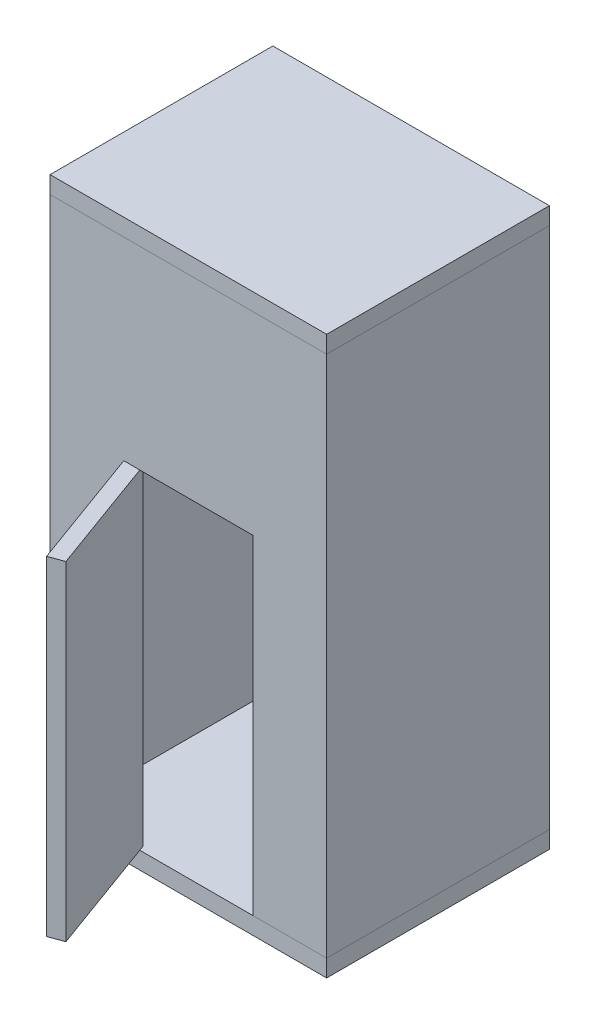
ISO-10303-21;
HEADER;
FILE_DESCRIPTION(('STEP AP214'),'2;1');
FILE_NAME('part.step','',(''),(''),'','','');
FILE_SCHEMA(('AUTOMOTIVE_DESIGN { 1 0 10303 214 1 1 1 1 }'));
ENDSEC;
DATA;
#1=APPLICATION_CONTEXT('core data for automotive mechanical design processes');
#2=APPLICATION_PROTOCOL_DEFINITION('international standard','automotive_design',2000,#1);
#3=PRODUCT_CONTEXT('',#1,'mechanical');
#4=PRODUCT('Part','Part','',(#3));
#5=PRODUCT_RELATED_PRODUCT_CATEGORY('part','',(#4));
#6=PRODUCT_DEFINITION_FORMATION('','',#4);
#7=PRODUCT_DEFINITION_CONTEXT('part definition',#1,'design');
#8=PRODUCT_DEFINITION('design','',#6,#7);
#9=PRODUCT_DEFINITION_SHAPE('','',#8);
#10=(LENGTH_UNIT() NAMED_UNIT(*) SI_UNIT(.MILLI.,.METRE.));
#11=(NAMED_UNIT(*) PLANE_ANGLE_UNIT() SI_UNIT($,.RADIAN.));
#12=(NAMED_UNIT(*) SI_UNIT($,.STERADIAN.) SOLID_ANGLE_UNIT());
#13=UNCERTAINTY_MEASURE_WITH_UNIT(LENGTH_MEASURE(1.E-05),#10,'distance_accuracy_value','');
#14=(GEOMETRIC_REPRESENTATION_CONTEXT(3) GLOBAL_UNCERTAINTY_ASSIGNED_CONTEXT((#13)) GLOBAL_UNIT_ASSIGNED_CONTEXT((#10,
#11,#12)) REPRESENTATION_CONTEXT('',''));
#15=CARTESIAN_POINT('',(0.,0.,0.));
#16=DIRECTION('',(0.,0.,1.));
#17=DIRECTION('',(1.,0.,0.));
#18=AXIS2_PLACEMENT_3D('',#15,#16,#17);
#19=CARTESIAN_POINT('',(0.,1943.1,0.));
#20=DIRECTION('',(0.,1.,0.));
#21=DIRECTION('',(0.,0.,1.));
#22=AXIS2_PLACEMENT_3D('',#19,#20,#21);
#23=PLANE('',#22);
#24=DIRECTION('',(0.939692620785909,0.,-0.342020143325667));
#25=VECTOR('',#24,1.);
#26=CARTESIAN_POINT('',(-297.461326012133,1943.1,626.819409258348));
#27=LINE('',#26,#25);
#28=CARTESIAN_POINT('',(-381.,1943.1,657.225));
#29=VERTEX_POINT('',#28);
#30=CARTESIAN_POINT('',(-297.461326012133,1943.1,626.819409258348));
#31=VERTEX_POINT('',#30);
#32=EDGE_CURVE('E101',#29,#31,#27,.T.);
#33=ORIENTED_EDGE('',*,*,#32,.F.);
#34=DIRECTION('',(-0.342020143325665,0.,-0.93969262078591));
#35=VECTOR('',#34,1.);
#36=CARTESIAN_POINT('',(-381.,1943.1,657.225));
#37=LINE('',#36,#35);
#38=CARTESIAN_POINT('',(-120.380650785843,1943.10000000001,1373.27077703886));
#39=VERTEX_POINT('',#38);
#40=EDGE_CURVE('E112',#39,#29,#37,.T.);
#41=ORIENTED_EDGE('',*,*,#40,.F.);
#42=DIRECTION('',(-0.939692620785909,0.,0.342020143325667));
#43=VECTOR('',#42,1.);
#44=CARTESIAN_POINT('',(-120.380650785843,1943.10000000001,1373.27077703886));
#45=LINE('',#44,#43);
#46=CARTESIAN_POINT('',(-36.8419767979757,1943.10000000001,1342.86518629721));
#47=VERTEX_POINT('',#46);
#48=EDGE_CURVE('E103',#47,#39,#45,.T.);
#49=ORIENTED_EDGE('',*,*,#48,.F.);
#50=DIRECTION('',(0.342020143325665,0.,0.93969262078591));
#51=VECTOR('',#50,1.);
#52=CARTESIAN_POINT('',(-36.8419767979757,1943.10000000001,1342.86518629721));
#53=LINE('',#52,#51);
#54=EDGE_CURVE('E93',#31,#47,#53,.T.);
#55=ORIENTED_EDGE('',*,*,#54,.F.);
#56=EDGE_LOOP('',(#33,#41,#49,#55));
#57=FACE_BOUND('',#56,.T.);
#58=ADVANCED_FACE('F51',(#57),#23,.T.);
#59=CARTESIAN_POINT('',(-381.,-821.969822679475,657.224999999999));
#60=DIRECTION('',(0.93969262078591,0.,-0.342020143325665));
#61=DIRECTION('',(-0.342020143325665,0.,-0.93969262078591));
#62=AXIS2_PLACEMENT_3D('',#59,#60,#61);
#63=PLANE('',#62);
#64=DIRECTION('',(0.,1.,0.));
#65=VECTOR('',#64,1.);
#66=CARTESIAN_POINT('',(-381.,-821.969822679475,657.224999999999));
#67=LINE('',#66,#65);
#68=CARTESIAN_POINT('',(-381.,0.,657.225));
#69=VERTEX_POINT('',#68);
#70=EDGE_CURVE('E106',#69,#29,#67,.T.);
#71=ORIENTED_EDGE('',*,*,#70,.F.);
#72=DIRECTION('',(0.342020143325665,0.,0.93969262078591));
#73=VECTOR('',#72,1.);
#74=CARTESIAN_POINT('',(-381.,0.,657.225));
#75=LINE('',#74,#73);
#76=CARTESIAN_POINT('',(-120.380650785843,-2.22044604925031E-13,1373.27077703886));
#77=VERTEX_POINT('',#76);
#78=EDGE_CURVE('E55',#69,#77,#75,.T.);
#79=ORIENTED_EDGE('',*,*,#78,.T.);
#80=DIRECTION('',(0.,1.,0.));
#81=VECTOR('',#80,1.);
#82=CARTESIAN_POINT('',(-120.380650785843,-821.969822679476,1373.27077703886));
#83=LINE('',#82,#81);
#84=EDGE_CURVE('E115',#77,#39,#83,.T.);
#85=ORIENTED_EDGE('',*,*,#84,.T.);
#86=ORIENTED_EDGE('',*,*,#40,.T.);
#87=EDGE_LOOP('',(#71,#79,#85,#86));
#88=FACE_BOUND('',#87,.T.);
#89=ADVANCED_FACE('F124',(#88),#63,.F.);
#90=CARTESIAN_POINT('',(-120.380650785843,-821.969822679476,1373.27077703886));
#91=DIRECTION('',(-0.342020143325667,0.,-0.939692620785909));
#92=DIRECTION('',(-0.939692620785909,0.,0.342020143325667));
#93=AXIS2_PLACEMENT_3D('',#90,#91,#92);
#94=PLANE('',#93);
#95=ORIENTED_EDGE('',*,*,#84,.F.);
#96=DIRECTION('',(0.939692620785909,0.,-0.342020143325667));
#97=VECTOR('',#96,1.);
#98=CARTESIAN_POINT('',(-120.380650785843,0.,1373.27077703886));
#99=LINE('',#98,#97);
#100=CARTESIAN_POINT('',(-36.8419767979755,0.,1342.86518629721));
#101=VERTEX_POINT('',#100);
#102=EDGE_CURVE('E121',#77,#101,#99,.T.);
#103=ORIENTED_EDGE('',*,*,#102,.T.);
#104=DIRECTION('',(0.,1.,0.));
#105=VECTOR('',#104,1.);
#106=CARTESIAN_POINT('',(-36.8419767979757,-821.969822679475,1342.86518629721));
#107=LINE('',#106,#105);
#108=EDGE_CURVE('E97',#101,#47,#107,.T.);
#109=ORIENTED_EDGE('',*,*,#108,.T.);
#110=ORIENTED_EDGE('',*,*,#48,.T.);
#111=EDGE_LOOP('',(#95,#103,#109,#110));
#112=FACE_BOUND('',#111,.T.);
#113=ADVANCED_FACE('F120',(#112),#94,.F.);
#114=CARTESIAN_POINT('',(-36.8419767979757,-821.969822679475,1342.86518629721));
#115=DIRECTION('',(-0.93969262078591,0.,0.342020143325665));
#116=DIRECTION('',(0.342020143325665,0.,0.93969262078591));
#117=AXIS2_PLACEMENT_3D('',#114,#115,#116);
#118=PLANE('',#117);
#119=ORIENTED_EDGE('',*,*,#108,.F.);
#120=DIRECTION('',(-0.342020143325665,0.,-0.93969262078591));
#121=VECTOR('',#120,1.);
#122=CARTESIAN_POINT('',(-36.8419767979755,0.,1342.86518629721));
#123=LINE('',#122,#121);
#124=CARTESIAN_POINT('',(-297.461326012133,0.,626.819409258348));
#125=VERTEX_POINT('',#124);
#126=EDGE_CURVE('E60',#101,#125,#123,.T.);
#127=ORIENTED_EDGE('',*,*,#126,.T.);
#128=DIRECTION('',(0.,1.,0.));
#129=VECTOR('',#128,1.);
#130=CARTESIAN_POINT('',(-297.461326012133,-821.969822679475,626.819409258347));
#131=LINE('',#130,#129);
#132=EDGE_CURVE('E90',#125,#31,#131,.T.);
#133=ORIENTED_EDGE('',*,*,#132,.T.);
#134=ORIENTED_EDGE('',*,*,#54,.T.);
#135=EDGE_LOOP('',(#119,#127,#133,#134));
#136=FACE_BOUND('',#135,.T.);
#137=ADVANCED_FACE('F92',(#136),#118,.F.);
#138=CARTESIAN_POINT('',(-297.461326012133,-821.969822679475,626.819409258347));
#139=DIRECTION('',(0.342020143325667,0.,0.939692620785909));
#140=DIRECTION('',(0.939692620785909,0.,-0.342020143325667));
#141=AXIS2_PLACEMENT_3D('',#138,#139,#140);
#142=PLANE('',#141);
#143=ORIENTED_EDGE('',*,*,#132,.F.);
#144=DIRECTION('',(-0.939692620785909,0.,0.342020143325667));
#145=VECTOR('',#144,1.);
#146=CARTESIAN_POINT('',(-297.461326012133,0.,626.819409258348));
#147=LINE('',#146,#145);
#148=EDGE_CURVE('E12',#125,#69,#147,.T.);
#149=ORIENTED_EDGE('',*,*,#148,.T.);
#150=ORIENTED_EDGE('',*,*,#70,.T.);
#151=ORIENTED_EDGE('',*,*,#32,.T.);
#152=EDGE_LOOP('',(#143,#149,#150,#151));
#153=FACE_BOUND('',#152,.T.);
#154=ADVANCED_FACE('F53',(#153),#142,.F.);
#155=CARTESIAN_POINT('',(0.,0.,0.));
#156=DIRECTION('',(0.,1.,0.));
#157=DIRECTION('',(0.,0.,1.));
#158=AXIS2_PLACEMENT_3D('',#155,#156,#157);
#159=PLANE('',#158);
#160=ORIENTED_EDGE('',*,*,#126,.F.);
#161=ORIENTED_EDGE('',*,*,#102,.F.);
#162=ORIENTED_EDGE('',*,*,#78,.F.);
#163=ORIENTED_EDGE('',*,*,#148,.F.);
#164=EDGE_LOOP('',(#160,#161,#162,#163));
#165=FACE_BOUND('',#164,.T.);
#166=ADVANCED_FACE('F138',(#165),#159,.F.);
#167=CLOSED_SHELL('',(#58,#89,#113,#137,#154,#166));
#168=MANIFOLD_SOLID_BREP('B2',#167);
#169=CARTESIAN_POINT('',(815.975000000001,-101.6,-657.225));
#170=DIRECTION('',(-1.,0.,0.));
#171=DIRECTION('',(0.,0.,1.));
#172=AXIS2_PLACEMENT_3D('',#169,#170,#171);
#173=PLANE('',#172);
#174=DIRECTION('',(0.,0.,1.));
#175=VECTOR('',#174,1.);
#176=CARTESIAN_POINT('',(815.975000000001,0.,-657.225));
#177=LINE('',#176,#175);
#178=CARTESIAN_POINT('',(815.975000000001,0.,-657.225));
#179=VERTEX_POINT('',#178);
#180=CARTESIAN_POINT('',(815.974999999999,6.10622663543836E-13,657.224999999999));
#181=VERTEX_POINT('',#180);
#182=EDGE_CURVE('E247',#179,#181,#177,.T.);
#183=ORIENTED_EDGE('',*,*,#182,.T.);
#184=DIRECTION('',(0.,1.,0.));
#185=VECTOR('',#184,1.);
#186=CARTESIAN_POINT('',(815.974999999999,-101.6,657.225));
#187=LINE('',#186,#185);
#188=CARTESIAN_POINT('',(815.974999999999,-101.6,657.225));
#189=VERTEX_POINT('',#188);
#190=EDGE_CURVE('E49',#189,#181,#187,.T.);
#191=ORIENTED_EDGE('',*,*,#190,.F.);
#192=DIRECTION('',(0.,0.,1.));
#193=VECTOR('',#192,1.);
#194=CARTESIAN_POINT('',(815.975000000001,-101.6,-657.225));
#195=LINE('',#194,#193);
#196=CARTESIAN_POINT('',(815.975000000001,-101.6,-657.225));
#197=VERTEX_POINT('',#196);
#198=EDGE_CURVE('E235',#197,#189,#195,.T.);
#199=ORIENTED_EDGE('',*,*,#198,.F.);
#200=DIRECTION('',(0.,1.,0.));
#201=VECTOR('',#200,1.);
#202=CARTESIAN_POINT('',(815.975000000001,-101.6,-657.225));
#203=LINE('',#202,#201);
#204=EDGE_CURVE('E243',#197,#179,#203,.T.);
#205=ORIENTED_EDGE('',*,*,#204,.T.);
#206=EDGE_LOOP('',(#183,#191,#199,#205));
#207=FACE_BOUND('',#206,.T.);
#208=ADVANCED_FACE('F184',(#207),#173,.F.);
#209=CARTESIAN_POINT('',(-815.975,-101.6,657.225));
#210=DIRECTION('',(0.,0.,-1.));
#211=DIRECTION('',(-1.,0.,0.));
#212=AXIS2_PLACEMENT_3D('',#209,#210,#211);
#213=PLANE('',#212);
#214=DIRECTION('',(-1.,0.,0.));
#215=VECTOR('',#214,1.);
#216=CARTESIAN_POINT('',(-815.975,6.10622663543836E-13,657.225));
#217=LINE('',#216,#215);
#218=CARTESIAN_POINT('',(-815.975,6.10622663543836E-13,657.225));
#219=VERTEX_POINT('',#218);
#220=EDGE_CURVE('E239',#181,#219,#217,.T.);
#221=ORIENTED_EDGE('',*,*,#220,.T.);
#222=DIRECTION('',(0.,1.,0.));
#223=VECTOR('',#222,1.);
#224=CARTESIAN_POINT('',(-815.975,-101.6,657.225));
#225=LINE('',#224,#223);
#226=CARTESIAN_POINT('',(-815.975,-101.6,657.225));
#227=VERTEX_POINT('',#226);
#228=EDGE_CURVE('E192',#227,#219,#225,.T.);
#229=ORIENTED_EDGE('',*,*,#228,.F.);
#230=DIRECTION('',(-1.,0.,0.));
#231=VECTOR('',#230,1.);
#232=CARTESIAN_POINT('',(-815.975,-101.6,657.225));
#233=LINE('',#232,#231);
#234=EDGE_CURVE('E230',#189,#227,#233,.T.);
#235=ORIENTED_EDGE('',*,*,#234,.F.);
#236=ORIENTED_EDGE('',*,*,#190,.T.);
#237=EDGE_LOOP('',(#221,#229,#235,#236));
#238=FACE_BOUND('',#237,.T.);
#239=ADVANCED_FACE('F238',(#238),#213,.F.);
#240=CARTESIAN_POINT('',(-815.974999999998,-101.6,-657.225));
#241=DIRECTION('',(1.,0.,0.));
#242=DIRECTION('',(0.,0.,-1.));
#243=AXIS2_PLACEMENT_3D('',#240,#241,#242);
#244=PLANE('',#243);
#245=DIRECTION('',(0.,0.,-1.));
#246=VECTOR('',#245,1.);
#247=CARTESIAN_POINT('',(-815.975,0.,-657.225));
#248=LINE('',#247,#246);
#249=CARTESIAN_POINT('',(-815.975,0.,-657.225));
#250=VERTEX_POINT('',#249);
#251=EDGE_CURVE('E217',#219,#250,#248,.T.);
#252=ORIENTED_EDGE('',*,*,#251,.T.);
#253=DIRECTION('',(0.,1.,0.));
#254=VECTOR('',#253,1.);
#255=CARTESIAN_POINT('',(-815.974999999998,-101.6,-657.225));
#256=LINE('',#255,#254);
#257=CARTESIAN_POINT('',(-815.974999999998,-101.6,-657.225));
#258=VERTEX_POINT('',#257);
#259=EDGE_CURVE('E240',#258,#250,#256,.T.);
#260=ORIENTED_EDGE('',*,*,#259,.F.);
#261=DIRECTION('',(0.,0.,-1.));
#262=VECTOR('',#261,1.);
#263=CARTESIAN_POINT('',(-815.974999999998,-101.6,-657.225));
#264=LINE('',#263,#262);
#265=EDGE_CURVE('E233',#227,#258,#264,.T.);
#266=ORIENTED_EDGE('',*,*,#265,.F.);
#267=ORIENTED_EDGE('',*,*,#228,.T.);
#268=EDGE_LOOP('',(#252,#260,#266,#267));
#269=FACE_BOUND('',#268,.T.);
#270=ADVANCED_FACE('F241',(#269),#244,.F.);
#271=CARTESIAN_POINT('',(-815.974999999998,-101.6,-657.225));
#272=DIRECTION('',(0.,0.,1.));
#273=DIRECTION('',(1.,0.,0.));
#274=AXIS2_PLACEMENT_3D('',#271,#272,#273);
#275=PLANE('',#274);
#276=DIRECTION('',(1.,0.,0.));
#277=VECTOR('',#276,1.);
#278=CARTESIAN_POINT('',(-815.975,0.,-657.225));
#279=LINE('',#278,#277);
#280=EDGE_CURVE('E223',#250,#179,#279,.T.);
#281=ORIENTED_EDGE('',*,*,#280,.T.);
#282=ORIENTED_EDGE('',*,*,#204,.F.);
#283=DIRECTION('',(1.,0.,0.));
#284=VECTOR('',#283,1.);
#285=CARTESIAN_POINT('',(-815.974999999998,-101.6,-657.225));
#286=LINE('',#285,#284);
#287=EDGE_CURVE('E200',#258,#197,#286,.T.);
#288=ORIENTED_EDGE('',*,*,#287,.F.);
#289=ORIENTED_EDGE('',*,*,#259,.T.);
#290=EDGE_LOOP('',(#281,#282,#288,#289));
#291=FACE_BOUND('',#290,.T.);
#292=ADVANCED_FACE('F254',(#291),#275,.F.);
#293=CARTESIAN_POINT('',(0.,-101.6,0.));
#294=DIRECTION('',(0.,1.,0.));
#295=DIRECTION('',(0.,0.,1.));
#296=AXIS2_PLACEMENT_3D('',#293,#294,#295);
#297=PLANE('',#296);
#298=ORIENTED_EDGE('',*,*,#198,.T.);
#299=ORIENTED_EDGE('',*,*,#234,.T.);
#300=ORIENTED_EDGE('',*,*,#265,.T.);
#301=ORIENTED_EDGE('',*,*,#287,.T.);
#302=EDGE_LOOP('',(#298,#299,#300,#301));
#303=FACE_BOUND('',#302,.T.);
#304=ADVANCED_FACE('F231',(#303),#297,.F.);
#305=CARTESIAN_POINT('',(0.,0.,0.));
#306=DIRECTION('',(0.,1.,0.));
#307=DIRECTION('',(0.,0.,1.));
#308=AXIS2_PLACEMENT_3D('',#305,#306,#307);
#309=PLANE('',#308);
#310=ORIENTED_EDGE('',*,*,#182,.F.);
#311=ORIENTED_EDGE('',*,*,#280,.F.);
#312=ORIENTED_EDGE('',*,*,#251,.F.);
#313=ORIENTED_EDGE('',*,*,#220,.F.);
#314=EDGE_LOOP('',(#310,#311,#312,#313));
#315=FACE_BOUND('',#314,.T.);
#316=ADVANCED_FACE('F257',(#315),#309,.T.);
#317=CLOSED_SHELL('',(#208,#239,#270,#292,#304,#316));
#318=MANIFOLD_SOLID_BREP('B6',#317);
#319=CARTESIAN_POINT('',(-815.975000000002,3187.7,657.224999999999));
#320=DIRECTION('',(0.,0.,-1.));
#321=DIRECTION('',(-1.,0.,0.));
#322=AXIS2_PLACEMENT_3D('',#319,#320,#321);
#323=PLANE('',#322);
#324=DIRECTION('',(1.,0.,0.));
#325=VECTOR('',#324,1.);
#326=CARTESIAN_POINT('',(-815.975,3086.1,657.224999999999));
#327=LINE('',#326,#325);
#328=CARTESIAN_POINT('',(-815.975,3086.1,657.224999999999));
#329=VERTEX_POINT('',#328);
#330=CARTESIAN_POINT('',(815.974999999999,3086.1,657.225));
#331=VERTEX_POINT('',#330);
#332=EDGE_CURVE('E379',#329,#331,#327,.T.);
#333=ORIENTED_EDGE('',*,*,#332,.T.);
#334=DIRECTION('',(0.,-1.,0.));
#335=VECTOR('',#334,1.);
#336=CARTESIAN_POINT('',(815.974999999999,3187.7,657.225));
#337=LINE('',#336,#335);
#338=CARTESIAN_POINT('',(815.974999999999,3187.7,657.225));
#339=VERTEX_POINT('',#338);
#340=EDGE_CURVE('E182',#339,#331,#337,.T.);
#341=ORIENTED_EDGE('',*,*,#340,.F.);
#342=DIRECTION('',(1.,0.,0.));
#343=VECTOR('',#342,1.);
#344=CARTESIAN_POINT('',(-815.975000000002,3187.7,657.224999999999));
#345=LINE('',#344,#343);
#346=CARTESIAN_POINT('',(-815.975000000002,3187.7,657.224999999999));
#347=VERTEX_POINT('',#346);
#348=EDGE_CURVE('E367',#347,#339,#345,.T.);
#349=ORIENTED_EDGE('',*,*,#348,.F.);
#350=DIRECTION('',(0.,-1.,0.));
#351=VECTOR('',#350,1.);
#352=CARTESIAN_POINT('',(-815.975000000002,3187.7,657.224999999999));
#353=LINE('',#352,#351);
#354=EDGE_CURVE('E375',#347,#329,#353,.T.);
#355=ORIENTED_EDGE('',*,*,#354,.T.);
#356=EDGE_LOOP('',(#333,#341,#349,#355));
#357=FACE_BOUND('',#356,.T.);
#358=ADVANCED_FACE('F316',(#357),#323,.F.);
#359=CARTESIAN_POINT('',(815.974999999999,3187.7,657.225));
#360=DIRECTION('',(-1.,0.,0.));
#361=DIRECTION('',(0.,0.,1.));
#362=AXIS2_PLACEMENT_3D('',#359,#360,#361);
#363=PLANE('',#362);
#364=DIRECTION('',(0.,0.,-1.));
#365=VECTOR('',#364,1.);
#366=CARTESIAN_POINT('',(815.974999999999,3086.1,657.225));
#367=LINE('',#366,#365);
#368=CARTESIAN_POINT('',(815.975000000001,3086.1,-657.225));
#369=VERTEX_POINT('',#368);
#370=EDGE_CURVE('E371',#331,#369,#367,.T.);
#371=ORIENTED_EDGE('',*,*,#370,.T.);
#372=DIRECTION('',(0.,-1.,0.));
#373=VECTOR('',#372,1.);
#374=CARTESIAN_POINT('',(815.974999999999,3187.7,-657.225));
#375=LINE('',#374,#373);
#376=CARTESIAN_POINT('',(815.974999999999,3187.7,-657.225));
#377=VERTEX_POINT('',#376);
#378=EDGE_CURVE('E324',#377,#369,#375,.T.);
#379=ORIENTED_EDGE('',*,*,#378,.F.);
#380=DIRECTION('',(0.,0.,-1.));
#381=VECTOR('',#380,1.);
#382=CARTESIAN_POINT('',(815.974999999999,3187.7,657.225));
#383=LINE('',#382,#381);
#384=EDGE_CURVE('E362',#339,#377,#383,.T.);
#385=ORIENTED_EDGE('',*,*,#384,.F.);
#386=ORIENTED_EDGE('',*,*,#340,.T.);
#387=EDGE_LOOP('',(#371,#379,#385,#386));
#388=FACE_BOUND('',#387,.T.);
#389=ADVANCED_FACE('F370',(#388),#363,.F.);
#390=CARTESIAN_POINT('',(815.974999999999,3187.7,-657.225));
#391=DIRECTION('',(0.,0.,1.));
#392=DIRECTION('',(1.,0.,0.));
#393=AXIS2_PLACEMENT_3D('',#390,#391,#392);
#394=PLANE('',#393);
#395=DIRECTION('',(-1.,0.,0.));
#396=VECTOR('',#395,1.);
#397=CARTESIAN_POINT('',(815.975000000001,3086.1,-657.225));
#398=LINE('',#397,#396);
#399=CARTESIAN_POINT('',(-815.975,3086.1,-657.225));
#400=VERTEX_POINT('',#399);
#401=EDGE_CURVE('E349',#369,#400,#398,.T.);
#402=ORIENTED_EDGE('',*,*,#401,.T.);
#403=DIRECTION('',(0.,-1.,0.));
#404=VECTOR('',#403,1.);
#405=CARTESIAN_POINT('',(-815.975,3187.7,-657.225));
#406=LINE('',#405,#404);
#407=CARTESIAN_POINT('',(-815.975,3187.7,-657.225));
#408=VERTEX_POINT('',#407);
#409=EDGE_CURVE('E372',#408,#400,#406,.T.);
#410=ORIENTED_EDGE('',*,*,#409,.F.);
#411=DIRECTION('',(-1.,0.,0.));
#412=VECTOR('',#411,1.);
#413=CARTESIAN_POINT('',(815.974999999999,3187.7,-657.225));
#414=LINE('',#413,#412);
#415=EDGE_CURVE('E365',#377,#408,#414,.T.);
#416=ORIENTED_EDGE('',*,*,#415,.F.);
#417=ORIENTED_EDGE('',*,*,#378,.T.);
#418=EDGE_LOOP('',(#402,#410,#416,#417));
#419=FACE_BOUND('',#418,.T.);
#420=ADVANCED_FACE('F373',(#419),#394,.F.);
#421=CARTESIAN_POINT('',(-815.975,3187.7,-657.225));
#422=DIRECTION('',(1.,0.,0.));
#423=DIRECTION('',(0.,0.,-1.));
#424=AXIS2_PLACEMENT_3D('',#421,#422,#423);
#425=PLANE('',#424);
#426=DIRECTION('',(0.,0.,1.));
#427=VECTOR('',#426,1.);
#428=CARTESIAN_POINT('',(-815.975,3086.1,-657.225));
#429=LINE('',#428,#427);
#430=EDGE_CURVE('E355',#400,#329,#429,.T.);
#431=ORIENTED_EDGE('',*,*,#430,.T.);
#432=ORIENTED_EDGE('',*,*,#354,.F.);
#433=DIRECTION('',(0.,0.,1.));
#434=VECTOR('',#433,1.);
#435=CARTESIAN_POINT('',(-815.975,3187.7,-657.225));
#436=LINE('',#435,#434);
#437=EDGE_CURVE('E332',#408,#347,#436,.T.);
#438=ORIENTED_EDGE('',*,*,#437,.F.);
#439=ORIENTED_EDGE('',*,*,#409,.T.);
#440=EDGE_LOOP('',(#431,#432,#438,#439));
#441=FACE_BOUND('',#440,.T.);
#442=ADVANCED_FACE('F386',(#441),#425,.F.);
#443=CARTESIAN_POINT('',(0.,3187.7,0.));
#444=DIRECTION('',(0.,1.,0.));
#445=DIRECTION('',(0.,0.,1.));
#446=AXIS2_PLACEMENT_3D('',#443,#444,#445);
#447=PLANE('',#446);
#448=ORIENTED_EDGE('',*,*,#348,.T.);
#449=ORIENTED_EDGE('',*,*,#384,.T.);
#450=ORIENTED_EDGE('',*,*,#415,.T.);
#451=ORIENTED_EDGE('',*,*,#437,.T.);
#452=EDGE_LOOP('',(#448,#449,#450,#451));
#453=FACE_BOUND('',#452,.T.);
#454=ADVANCED_FACE('F363',(#453),#447,.T.);
#455=CARTESIAN_POINT('',(0.,3086.1,0.));
#456=DIRECTION('',(0.,1.,0.));
#457=DIRECTION('',(0.,0.,1.));
#458=AXIS2_PLACEMENT_3D('',#455,#456,#457);
#459=PLANE('',#458);
#460=ORIENTED_EDGE('',*,*,#332,.F.);
#461=ORIENTED_EDGE('',*,*,#430,.F.);
#462=ORIENTED_EDGE('',*,*,#401,.F.);
#463=ORIENTED_EDGE('',*,*,#370,.F.);
#464=EDGE_LOOP('',(#460,#461,#462,#463));
#465=FACE_BOUND('',#464,.T.);
#466=ADVANCED_FACE('F389',(#465),#459,.F.);
#467=CLOSED_SHELL('',(#358,#389,#420,#442,#454,#466));
#468=MANIFOLD_SOLID_BREP('B43',#467);
#469=CARTESIAN_POINT('',(0.,0.,0.));
#470=DIRECTION('',(0.,-1.,0.));
#471=DIRECTION('',(0.,0.,-1.));
#472=AXIS2_PLACEMENT_3D('',#469,#470,#471);
#473=PLANE('',#472);
#474=DIRECTION('',(-1.,0.,0.));
#475=VECTOR('',#474,1.);
#476=CARTESIAN_POINT('',(-815.975,0.,-657.225));
#477=LINE('',#476,#475);
#478=CARTESIAN_POINT('',(-714.375,0.,-657.225));
#479=VERTEX_POINT('',#478);
#480=CARTESIAN_POINT('',(-815.975,0.,-657.225));
#481=VERTEX_POINT('',#480);
#482=EDGE_CURVE('E555',#479,#481,#477,.T.);
#483=ORIENTED_EDGE('',*,*,#482,.F.);
#484=DIRECTION('',(0.,0.,1.));
#485=VECTOR('',#484,1.);
#486=CARTESIAN_POINT('',(-714.375,0.,555.625));
#487=LINE('',#486,#485);
#488=CARTESIAN_POINT('',(-714.375,0.,555.625));
#489=VERTEX_POINT('',#488);
#490=EDGE_CURVE('E539',#479,#489,#487,.T.);
#491=ORIENTED_EDGE('',*,*,#490,.T.);
#492=DIRECTION('',(1.,0.,0.));
#493=VECTOR('',#492,1.);
#494=CARTESIAN_POINT('',(-714.375,0.,555.625));
#495=LINE('',#494,#493);
#496=CARTESIAN_POINT('',(-381.,0.,555.625));
#497=VERTEX_POINT('',#496);
#498=EDGE_CURVE('E597',#489,#497,#495,.T.);
#499=ORIENTED_EDGE('',*,*,#498,.T.);
#500=DIRECTION('',(0.,0.,1.));
#501=VECTOR('',#500,1.);
#502=CARTESIAN_POINT('',(-381.,0.,-657.226));
#503=LINE('',#502,#501);
#504=CARTESIAN_POINT('',(-381.,0.,657.225));
#505=VERTEX_POINT('',#504);
#506=EDGE_CURVE('E603',#497,#505,#503,.T.);
#507=ORIENTED_EDGE('',*,*,#506,.T.);
#508=DIRECTION('',(1.,0.,0.));
#509=VECTOR('',#508,1.);
#510=CARTESIAN_POINT('',(-815.975,6.10622663543836E-13,657.225));
#511=LINE('',#510,#509);
#512=CARTESIAN_POINT('',(-815.975,6.10622663543836E-13,657.225));
#513=VERTEX_POINT('',#512);
#514=EDGE_CURVE('E572',#513,#505,#511,.T.);
#515=ORIENTED_EDGE('',*,*,#514,.F.);
#516=DIRECTION('',(0.,0.,1.));
#517=VECTOR('',#516,1.);
#518=CARTESIAN_POINT('',(-815.975,6.10622663543836E-13,657.225));
#519=LINE('',#518,#517);
#520=EDGE_CURVE('E562',#481,#513,#519,.T.);
#521=ORIENTED_EDGE('',*,*,#520,.F.);
#522=EDGE_LOOP('',(#483,#491,#499,#507,#515,#521));
#523=FACE_BOUND('',#522,.T.);
#524=ADVANCED_FACE('F439',(#523),#473,.T.);
#525=CARTESIAN_POINT('',(-815.975,3086.1,-657.225));
#526=DIRECTION('',(0.,0.,1.));
#527=DIRECTION('',(1.,0.,0.));
#528=AXIS2_PLACEMENT_3D('',#525,#526,#527);
#529=PLANE('',#528);
#530=DIRECTION('',(-1.,0.,0.));
#531=VECTOR('',#530,1.);
#532=CARTESIAN_POINT('',(-815.975,3086.1,-657.225));
#533=LINE('',#532,#531);
#534=CARTESIAN_POINT('',(-714.375,3086.1,-657.225));
#535=VERTEX_POINT('',#534);
#536=CARTESIAN_POINT('',(-815.975,3086.1,-657.225));
#537=VERTEX_POINT('',#536);
#538=EDGE_CURVE('E557',#535,#537,#533,.T.);
#539=ORIENTED_EDGE('',*,*,#538,.F.);
#540=DIRECTION('',(0.,-1.,0.));
#541=VECTOR('',#540,1.);
#542=CARTESIAN_POINT('',(-714.375,3086.1,-657.225));
#543=LINE('',#542,#541);
#544=EDGE_CURVE('E542',#535,#479,#543,.T.);
#545=ORIENTED_EDGE('',*,*,#544,.T.);
#546=ORIENTED_EDGE('',*,*,#482,.T.);
#547=DIRECTION('',(0.,-1.,0.));
#548=VECTOR('',#547,1.);
#549=CARTESIAN_POINT('',(-815.975,3086.1,-657.225));
#550=LINE('',#549,#548);
#551=EDGE_CURVE('E447',#537,#481,#550,.T.);
#552=ORIENTED_EDGE('',*,*,#551,.F.);
#553=EDGE_LOOP('',(#539,#545,#546,#552));
#554=FACE_BOUND('',#553,.T.);
#555=ADVANCED_FACE('F553',(#554),#529,.F.);
#556=CARTESIAN_POINT('',(0.,3086.1,0.));
#557=DIRECTION('',(0.,-1.,0.));
#558=DIRECTION('',(0.,0.,-1.));
#559=AXIS2_PLACEMENT_3D('',#556,#557,#558);
#560=PLANE('',#559);
#561=DIRECTION('',(0.,0.,1.));
#562=VECTOR('',#561,1.);
#563=CARTESIAN_POINT('',(-714.375,3086.1,555.624999999999));
#564=LINE('',#563,#562);
#565=CARTESIAN_POINT('',(-714.375,3086.1,555.624999999999));
#566=VERTEX_POINT('',#565);
#567=EDGE_CURVE('E596',#535,#566,#564,.T.);
#568=ORIENTED_EDGE('',*,*,#567,.F.);
#569=ORIENTED_EDGE('',*,*,#538,.T.);
#570=DIRECTION('',(0.,0.,1.));
#571=VECTOR('',#570,1.);
#572=CARTESIAN_POINT('',(-815.975,3086.1,657.224999999999));
#573=LINE('',#572,#571);
#574=CARTESIAN_POINT('',(-815.975,3086.1,657.224999999999));
#575=VERTEX_POINT('',#574);
#576=EDGE_CURVE('E584',#537,#575,#573,.T.);
#577=ORIENTED_EDGE('',*,*,#576,.T.);
#578=DIRECTION('',(1.,0.,0.));
#579=VECTOR('',#578,1.);
#580=CARTESIAN_POINT('',(-815.975,3086.1,657.224999999999));
#581=LINE('',#580,#579);
#582=CARTESIAN_POINT('',(815.974999999999,3086.1,657.225));
#583=VERTEX_POINT('',#582);
#584=EDGE_CURVE('E463',#575,#583,#581,.T.);
#585=ORIENTED_EDGE('',*,*,#584,.T.);
#586=DIRECTION('',(0.,0.,-1.));
#587=VECTOR('',#586,1.);
#588=CARTESIAN_POINT('',(815.974999999999,3086.1,657.225));
#589=LINE('',#588,#587);
#590=CARTESIAN_POINT('',(815.975000000001,3086.1,-657.225));
#591=VERTEX_POINT('',#590);
#592=EDGE_CURVE('E575',#583,#591,#589,.T.);
#593=ORIENTED_EDGE('',*,*,#592,.T.);
#594=CARTESIAN_POINT('',(714.375000000001,3086.1,-657.225));
#595=VERTEX_POINT('',#594);
#596=EDGE_CURVE('E491',#591,#595,#533,.T.);
#597=ORIENTED_EDGE('',*,*,#596,.T.);
#598=DIRECTION('',(0.,0.,-1.));
#599=VECTOR('',#598,1.);
#600=CARTESIAN_POINT('',(714.375,3086.1,555.625));
#601=LINE('',#600,#599);
#602=CARTESIAN_POINT('',(714.375,3086.1,555.625));
#603=VERTEX_POINT('',#602);
#604=EDGE_CURVE('E593',#603,#595,#601,.T.);
#605=ORIENTED_EDGE('',*,*,#604,.F.);
#606=DIRECTION('',(1.,0.,0.));
#607=VECTOR('',#606,1.);
#608=CARTESIAN_POINT('',(-714.375,3086.1,555.624999999999));
#609=LINE('',#608,#607);
#610=EDGE_CURVE('E600',#566,#603,#609,.T.);
#611=ORIENTED_EDGE('',*,*,#610,.F.);
#612=EDGE_LOOP('',(#568,#569,#577,#585,#593,#597,#605,#611));
#613=FACE_BOUND('',#612,.T.);
#614=ADVANCED_FACE('F631',(#613),#560,.F.);
#615=DIRECTION('',(0.,0.,-1.));
#616=VECTOR('',#615,1.);
#617=CARTESIAN_POINT('',(714.375,0.,555.624999999999));
#618=LINE('',#617,#616);
#619=CARTESIAN_POINT('',(714.375,0.,555.624999999999));
#620=VERTEX_POINT('',#619);
#621=CARTESIAN_POINT('',(714.375000000001,0.,-657.225));
#622=VERTEX_POINT('',#621);
#623=EDGE_CURVE('E594',#620,#622,#618,.T.);
#624=ORIENTED_EDGE('',*,*,#623,.T.);
#625=CARTESIAN_POINT('',(815.975000000001,0.,-657.225));
#626=VERTEX_POINT('',#625);
#627=EDGE_CURVE('E563',#626,#622,#477,.T.);
#628=ORIENTED_EDGE('',*,*,#627,.F.);
#629=DIRECTION('',(0.,0.,-1.));
#630=VECTOR('',#629,1.);
#631=CARTESIAN_POINT('',(815.974999999999,6.10622663543836E-13,657.224999999999));
#632=LINE('',#631,#630);
#633=CARTESIAN_POINT('',(815.974999999999,6.10622663543836E-13,657.224999999999));
#634=VERTEX_POINT('',#633);
#635=EDGE_CURVE('E564',#634,#626,#632,.T.);
#636=ORIENTED_EDGE('',*,*,#635,.F.);
#637=CARTESIAN_POINT('',(381.,1.11022302462516E-13,657.225));
#638=VERTEX_POINT('',#637);
#639=EDGE_CURVE('E484',#638,#634,#511,.T.);
#640=ORIENTED_EDGE('',*,*,#639,.F.);
#641=DIRECTION('',(0.,0.,1.));
#642=VECTOR('',#641,1.);
#643=CARTESIAN_POINT('',(381.,0.,-657.226));
#644=LINE('',#643,#642);
#645=CARTESIAN_POINT('',(381.,0.,555.625));
#646=VERTEX_POINT('',#645);
#647=EDGE_CURVE('E608',#646,#638,#644,.T.);
#648=ORIENTED_EDGE('',*,*,#647,.F.);
#649=EDGE_CURVE('E549',#646,#620,#495,.T.);
#650=ORIENTED_EDGE('',*,*,#649,.T.);
#651=EDGE_LOOP('',(#624,#628,#636,#640,#648,#650));
#652=FACE_BOUND('',#651,.T.);
#653=ADVANCED_FACE('F638',(#652),#473,.T.);
#654=CARTESIAN_POINT('',(815.974999999999,3086.1,657.225));
#655=DIRECTION('',(-1.,0.,0.));
#656=DIRECTION('',(0.,0.,1.));
#657=AXIS2_PLACEMENT_3D('',#654,#655,#656);
#658=PLANE('',#657);
#659=ORIENTED_EDGE('',*,*,#635,.T.);
#660=DIRECTION('',(0.,-1.,0.));
#661=VECTOR('',#660,1.);
#662=CARTESIAN_POINT('',(815.975000000001,3086.1,-657.225));
#663=LINE('',#662,#661);
#664=EDGE_CURVE('E314',#591,#626,#663,.T.);
#665=ORIENTED_EDGE('',*,*,#664,.F.);
#666=ORIENTED_EDGE('',*,*,#592,.F.);
#667=DIRECTION('',(0.,-1.,0.));
#668=VECTOR('',#667,1.);
#669=CARTESIAN_POINT('',(815.974999999999,3086.1,657.225));
#670=LINE('',#669,#668);
#671=EDGE_CURVE('E576',#583,#634,#670,.T.);
#672=ORIENTED_EDGE('',*,*,#671,.T.);
#673=EDGE_LOOP('',(#659,#665,#666,#672));
#674=FACE_BOUND('',#673,.T.);
#675=ADVANCED_FACE('F441',(#674),#658,.F.);
#676=ORIENTED_EDGE('',*,*,#627,.T.);
#677=DIRECTION('',(0.,1.,0.));
#678=VECTOR('',#677,1.);
#679=CARTESIAN_POINT('',(714.375000000001,0.,-657.225));
#680=LINE('',#679,#678);
#681=EDGE_CURVE('E558',#622,#595,#680,.T.);
#682=ORIENTED_EDGE('',*,*,#681,.T.);
#683=ORIENTED_EDGE('',*,*,#596,.F.);
#684=ORIENTED_EDGE('',*,*,#664,.T.);
#685=EDGE_LOOP('',(#676,#682,#683,#684));
#686=FACE_BOUND('',#685,.T.);
#687=ADVANCED_FACE('F627',(#686),#529,.F.);
#688=CARTESIAN_POINT('',(-815.975,3086.1,657.224999999999));
#689=DIRECTION('',(1.,0.,0.));
#690=DIRECTION('',(0.,0.,-1.));
#691=AXIS2_PLACEMENT_3D('',#688,#689,#690);
#692=PLANE('',#691);
#693=ORIENTED_EDGE('',*,*,#520,.T.);
#694=DIRECTION('',(0.,-1.,0.));
#695=VECTOR('',#694,1.);
#696=CARTESIAN_POINT('',(-815.975,3086.1,657.224999999999));
#697=LINE('',#696,#695);
#698=EDGE_CURVE('E578',#575,#513,#697,.T.);
#699=ORIENTED_EDGE('',*,*,#698,.F.);
#700=ORIENTED_EDGE('',*,*,#576,.F.);
#701=ORIENTED_EDGE('',*,*,#551,.T.);
#702=EDGE_LOOP('',(#693,#699,#700,#701));
#703=FACE_BOUND('',#702,.T.);
#704=ADVANCED_FACE('F582',(#703),#692,.F.);
#705=CARTESIAN_POINT('',(-815.975,3086.1,657.224999999999));
#706=DIRECTION('',(0.,0.,-1.));
#707=DIRECTION('',(-1.,0.,0.));
#708=AXIS2_PLACEMENT_3D('',#705,#706,#707);
#709=PLANE('',#708);
#710=ORIENTED_EDGE('',*,*,#514,.T.);
#711=DIRECTION('',(0.,-1.,0.));
#712=VECTOR('',#711,1.);
#713=CARTESIAN_POINT('',(-381.,0.,657.225));
#714=LINE('',#713,#712);
#715=CARTESIAN_POINT('',(-381.,1943.1,657.225));
#716=VERTEX_POINT('',#715);
#717=EDGE_CURVE('E610',#716,#505,#714,.T.);
#718=ORIENTED_EDGE('',*,*,#717,.F.);
#719=DIRECTION('',(-1.,0.,0.));
#720=VECTOR('',#719,1.);
#721=CARTESIAN_POINT('',(-381.,1943.1,657.225));
#722=LINE('',#721,#720);
#723=CARTESIAN_POINT('',(381.000000000001,1943.1,657.225));
#724=VERTEX_POINT('',#723);
#725=EDGE_CURVE('E550',#724,#716,#722,.T.);
#726=ORIENTED_EDGE('',*,*,#725,.F.);
#727=DIRECTION('',(0.,1.,0.));
#728=VECTOR('',#727,1.);
#729=CARTESIAN_POINT('',(381.,1.11022302462516E-13,657.225));
#730=LINE('',#729,#728);
#731=EDGE_CURVE('E622',#638,#724,#730,.T.);
#732=ORIENTED_EDGE('',*,*,#731,.F.);
#733=ORIENTED_EDGE('',*,*,#639,.T.);
#734=ORIENTED_EDGE('',*,*,#671,.F.);
#735=ORIENTED_EDGE('',*,*,#584,.F.);
#736=ORIENTED_EDGE('',*,*,#698,.T.);
#737=EDGE_LOOP('',(#710,#718,#726,#732,#733,#734,#735,#736));
#738=FACE_BOUND('',#737,.T.);
#739=ADVANCED_FACE('F647',(#738),#709,.F.);
#740=CARTESIAN_POINT('',(-714.375,3086.1,555.624999999999));
#741=DIRECTION('',(1.,0.,0.));
#742=DIRECTION('',(0.,0.,-1.));
#743=AXIS2_PLACEMENT_3D('',#740,#741,#742);
#744=PLANE('',#743);
#745=ORIENTED_EDGE('',*,*,#490,.F.);
#746=ORIENTED_EDGE('',*,*,#544,.F.);
#747=ORIENTED_EDGE('',*,*,#567,.T.);
#748=DIRECTION('',(0.,-1.,0.));
#749=VECTOR('',#748,1.);
#750=CARTESIAN_POINT('',(-714.375,3086.1,555.624999999999));
#751=LINE('',#750,#749);
#752=EDGE_CURVE('E545',#566,#489,#751,.T.);
#753=ORIENTED_EDGE('',*,*,#752,.T.);
#754=EDGE_LOOP('',(#745,#746,#747,#753));
#755=FACE_BOUND('',#754,.T.);
#756=ADVANCED_FACE('F541',(#755),#744,.T.);
#757=CARTESIAN_POINT('',(-714.375,3086.1,555.624999999999));
#758=DIRECTION('',(0.,0.,-1.));
#759=DIRECTION('',(-1.,0.,0.));
#760=AXIS2_PLACEMENT_3D('',#757,#758,#759);
#761=PLANE('',#760);
#762=DIRECTION('',(0.,-1.,0.));
#763=VECTOR('',#762,1.);
#764=CARTESIAN_POINT('',(-381.,0.,555.625));
#765=LINE('',#764,#763);
#766=CARTESIAN_POINT('',(-381.,1943.1,555.625));
#767=VERTEX_POINT('',#766);
#768=EDGE_CURVE('E607',#767,#497,#765,.T.);
#769=ORIENTED_EDGE('',*,*,#768,.T.);
#770=ORIENTED_EDGE('',*,*,#498,.F.);
#771=ORIENTED_EDGE('',*,*,#752,.F.);
#772=ORIENTED_EDGE('',*,*,#610,.T.);
#773=DIRECTION('',(0.,-1.,0.));
#774=VECTOR('',#773,1.);
#775=CARTESIAN_POINT('',(714.375,3086.1,555.625));
#776=LINE('',#775,#774);
#777=EDGE_CURVE('E590',#603,#620,#776,.T.);
#778=ORIENTED_EDGE('',*,*,#777,.T.);
#779=ORIENTED_EDGE('',*,*,#649,.F.);
#780=DIRECTION('',(0.,1.,0.));
#781=VECTOR('',#780,1.);
#782=CARTESIAN_POINT('',(381.,0.,555.625));
#783=LINE('',#782,#781);
#784=CARTESIAN_POINT('',(380.999999999999,1943.1,555.625));
#785=VERTEX_POINT('',#784);
#786=EDGE_CURVE('E612',#646,#785,#783,.T.);
#787=ORIENTED_EDGE('',*,*,#786,.T.);
#788=DIRECTION('',(-1.,0.,0.));
#789=VECTOR('',#788,1.);
#790=CARTESIAN_POINT('',(-381.,1943.1,555.625));
#791=LINE('',#790,#789);
#792=EDGE_CURVE('E606',#785,#767,#791,.T.);
#793=ORIENTED_EDGE('',*,*,#792,.T.);
#794=EDGE_LOOP('',(#769,#770,#771,#772,#778,#779,#787,#793));
#795=FACE_BOUND('',#794,.T.);
#796=ADVANCED_FACE('F644',(#795),#761,.T.);
#797=CARTESIAN_POINT('',(714.375,3086.1,555.625));
#798=DIRECTION('',(-1.,0.,0.));
#799=DIRECTION('',(0.,0.,1.));
#800=AXIS2_PLACEMENT_3D('',#797,#798,#799);
#801=PLANE('',#800);
#802=ORIENTED_EDGE('',*,*,#623,.F.);
#803=ORIENTED_EDGE('',*,*,#777,.F.);
#804=ORIENTED_EDGE('',*,*,#604,.T.);
#805=ORIENTED_EDGE('',*,*,#681,.F.);
#806=EDGE_LOOP('',(#802,#803,#804,#805));
#807=FACE_BOUND('',#806,.T.);
#808=ADVANCED_FACE('F642',(#807),#801,.T.);
#809=CARTESIAN_POINT('',(-381.,0.,-657.226));
#810=DIRECTION('',(-1.,0.,0.));
#811=DIRECTION('',(0.,-1.,0.));
#812=AXIS2_PLACEMENT_3D('',#809,#810,#811);
#813=PLANE('',#812);
#814=DIRECTION('',(0.,0.,1.));
#815=VECTOR('',#814,1.);
#816=CARTESIAN_POINT('',(-381.,1943.1,-657.226));
#817=LINE('',#816,#815);
#818=EDGE_CURVE('E613',#767,#716,#817,.T.);
#819=ORIENTED_EDGE('',*,*,#818,.T.);
#820=ORIENTED_EDGE('',*,*,#717,.T.);
#821=ORIENTED_EDGE('',*,*,#506,.F.);
#822=ORIENTED_EDGE('',*,*,#768,.F.);
#823=EDGE_LOOP('',(#819,#820,#821,#822));
#824=FACE_BOUND('',#823,.T.);
#825=ADVANCED_FACE('F649',(#824),#813,.F.);
#826=CARTESIAN_POINT('',(-381.,1943.1,-657.226));
#827=DIRECTION('',(0.,1.,0.));
#828=DIRECTION('',(0.,0.,1.));
#829=AXIS2_PLACEMENT_3D('',#826,#827,#828);
#830=PLANE('',#829);
#831=DIRECTION('',(0.,0.,1.));
#832=VECTOR('',#831,1.);
#833=CARTESIAN_POINT('',(381.,1943.1,-657.226));
#834=LINE('',#833,#832);
#835=EDGE_CURVE('E454',#785,#724,#834,.T.);
#836=ORIENTED_EDGE('',*,*,#835,.T.);
#837=ORIENTED_EDGE('',*,*,#725,.T.);
#838=ORIENTED_EDGE('',*,*,#818,.F.);
#839=ORIENTED_EDGE('',*,*,#792,.F.);
#840=EDGE_LOOP('',(#836,#837,#838,#839));
#841=FACE_BOUND('',#840,.T.);
#842=ADVANCED_FACE('F652',(#841),#830,.F.);
#843=CARTESIAN_POINT('',(381.,0.,-657.226));
#844=DIRECTION('',(1.,0.,0.));
#845=DIRECTION('',(0.,1.,0.));
#846=AXIS2_PLACEMENT_3D('',#843,#844,#845);
#847=PLANE('',#846);
#848=ORIENTED_EDGE('',*,*,#647,.T.);
#849=ORIENTED_EDGE('',*,*,#731,.T.);
#850=ORIENTED_EDGE('',*,*,#835,.F.);
#851=ORIENTED_EDGE('',*,*,#786,.F.);
#852=EDGE_LOOP('',(#848,#849,#850,#851));
#853=FACE_BOUND('',#852,.T.);
#854=ADVANCED_FACE('F653',(#853),#847,.F.);
#855=CLOSED_SHELL('',(#524,#555,#614,#653,#675,#687,#704,#739,#756,#796,#808,#825,#842,#854));
#856=MANIFOLD_SOLID_BREP('B176',#855);
#857=ADVANCED_BREP_SHAPE_REPRESENTATION('',(#18,#168,#318,#468,#856),#14);
#858=SHAPE_DEFINITION_REPRESENTATION(#9,#857);
ENDSEC;
END-ISO-10303-21;
